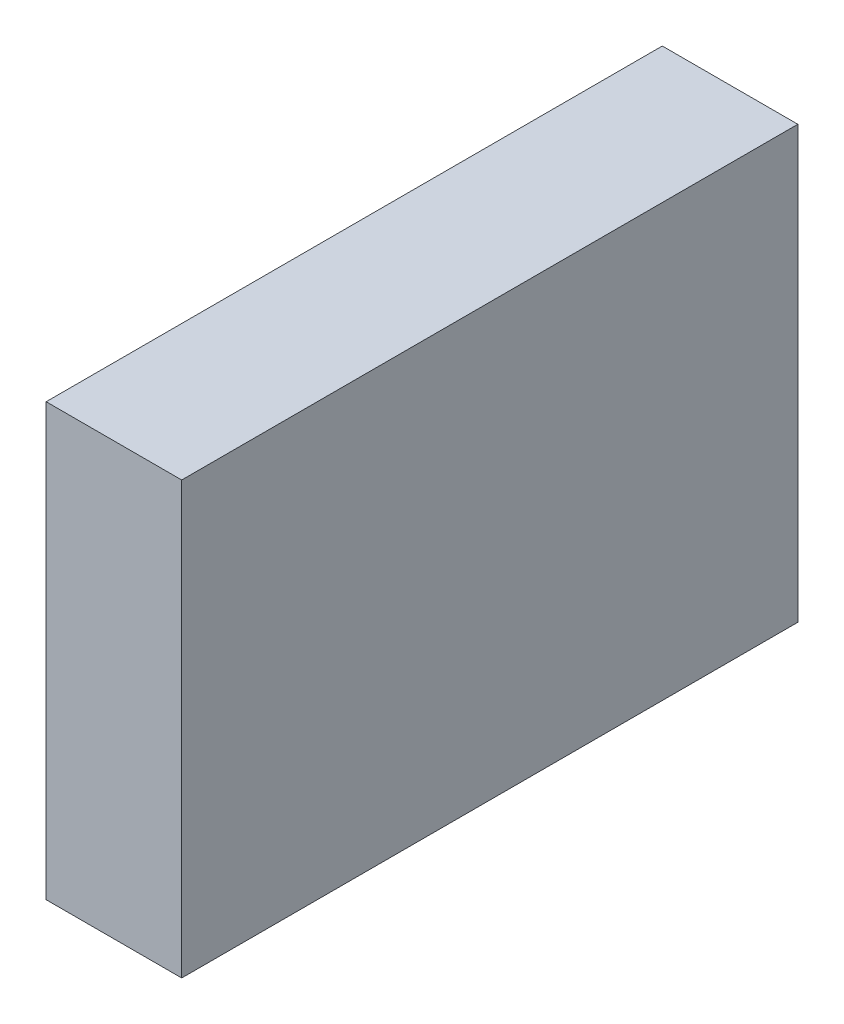
ISO-10303-21;
HEADER;
FILE_DESCRIPTION(('STEP AP214'),'2;1');
FILE_NAME('part.step','',(''),(''),'','','');
FILE_SCHEMA(('AUTOMOTIVE_DESIGN { 1 0 10303 214 1 1 1 1 }'));
ENDSEC;
DATA;
#1=APPLICATION_CONTEXT('core data for automotive mechanical design processes');
#2=APPLICATION_PROTOCOL_DEFINITION('international standard','automotive_design',2000,#1);
#3=PRODUCT_CONTEXT('',#1,'mechanical');
#4=PRODUCT('Part','Part','',(#3));
#5=PRODUCT_RELATED_PRODUCT_CATEGORY('part','',(#4));
#6=PRODUCT_DEFINITION_FORMATION('','',#4);
#7=PRODUCT_DEFINITION_CONTEXT('part definition',#1,'design');
#8=PRODUCT_DEFINITION('design','',#6,#7);
#9=PRODUCT_DEFINITION_SHAPE('','',#8);
#10=(LENGTH_UNIT() NAMED_UNIT(*) SI_UNIT(.MILLI.,.METRE.));
#11=(NAMED_UNIT(*) PLANE_ANGLE_UNIT() SI_UNIT($,.RADIAN.));
#12=(NAMED_UNIT(*) SI_UNIT($,.STERADIAN.) SOLID_ANGLE_UNIT());
#13=UNCERTAINTY_MEASURE_WITH_UNIT(LENGTH_MEASURE(1.E-05),#10,'distance_accuracy_value','');
#14=(GEOMETRIC_REPRESENTATION_CONTEXT(3) GLOBAL_UNCERTAINTY_ASSIGNED_CONTEXT((#13)) GLOBAL_UNIT_ASSIGNED_CONTEXT((#10,
#11,#12)) REPRESENTATION_CONTEXT('',''));
#15=CARTESIAN_POINT('',(0.,0.,0.));
#16=DIRECTION('',(0.,0.,1.));
#17=DIRECTION('',(1.,0.,0.));
#18=AXIS2_PLACEMENT_3D('',#15,#16,#17);
#19=CARTESIAN_POINT('',(0.,70.,0.));
#20=DIRECTION('',(0.,0.,1.));
#21=DIRECTION('',(1.,0.,0.));
#22=AXIS2_PLACEMENT_3D('',#19,#20,#21);
#23=PLANE('',#22);
#24=DIRECTION('',(0.,1.,0.));
#25=VECTOR('',#24,1.);
#26=CARTESIAN_POINT('',(0.,0.,0.));
#27=LINE('',#26,#25);
#28=CARTESIAN_POINT('',(0.,0.,0.));
#29=VERTEX_POINT('',#28);
#30=CARTESIAN_POINT('',(0.,70.,0.));
#31=VERTEX_POINT('',#30);
#32=EDGE_CURVE('E40',#29,#31,#27,.T.);
#33=ORIENTED_EDGE('',*,*,#32,.F.);
#34=DIRECTION('',(1.,0.,0.));
#35=VECTOR('',#34,1.);
#36=CARTESIAN_POINT('',(0.,0.,0.));
#37=LINE('',#36,#35);
#38=CARTESIAN_POINT('',(22.,0.,0.));
#39=VERTEX_POINT('',#38);
#40=EDGE_CURVE('E11',#29,#39,#37,.T.);
#41=ORIENTED_EDGE('',*,*,#40,.T.);
#42=DIRECTION('',(0.,-1.,0.));
#43=VECTOR('',#42,1.);
#44=CARTESIAN_POINT('',(22.,0.,0.));
#45=LINE('',#44,#43);
#46=CARTESIAN_POINT('',(22.,70.,0.));
#47=VERTEX_POINT('',#46);
#48=EDGE_CURVE('E102',#47,#39,#45,.T.);
#49=ORIENTED_EDGE('',*,*,#48,.F.);
#50=DIRECTION('',(1.,0.,0.));
#51=VECTOR('',#50,1.);
#52=CARTESIAN_POINT('',(0.,70.,0.));
#53=LINE('',#52,#51);
#54=EDGE_CURVE('E27',#31,#47,#53,.T.);
#55=ORIENTED_EDGE('',*,*,#54,.F.);
#56=EDGE_LOOP('',(#33,#41,#49,#55));
#57=FACE_BOUND('',#56,.T.);
#58=ADVANCED_FACE('F16',(#57),#23,.T.);
#59=CARTESIAN_POINT('',(0.,70.,-100.));
#60=DIRECTION('',(0.,1.,0.));
#61=DIRECTION('',(1.,0.,0.));
#62=AXIS2_PLACEMENT_3D('',#59,#60,#61);
#63=PLANE('',#62);
#64=DIRECTION('',(0.,0.,-1.));
#65=VECTOR('',#64,1.);
#66=CARTESIAN_POINT('',(0.,70.,0.));
#67=LINE('',#66,#65);
#68=CARTESIAN_POINT('',(0.,70.,-100.));
#69=VERTEX_POINT('',#68);
#70=EDGE_CURVE('E74',#31,#69,#67,.T.);
#71=ORIENTED_EDGE('',*,*,#70,.F.);
#72=ORIENTED_EDGE('',*,*,#54,.T.);
#73=DIRECTION('',(0.,0.,1.));
#74=VECTOR('',#73,1.);
#75=CARTESIAN_POINT('',(22.,70.,0.));
#76=LINE('',#75,#74);
#77=CARTESIAN_POINT('',(22.,70.,-100.));
#78=VERTEX_POINT('',#77);
#79=EDGE_CURVE('E20',#78,#47,#76,.T.);
#80=ORIENTED_EDGE('',*,*,#79,.F.);
#81=DIRECTION('',(1.,0.,0.));
#82=VECTOR('',#81,1.);
#83=CARTESIAN_POINT('',(0.,70.,-100.));
#84=LINE('',#83,#82);
#85=EDGE_CURVE('E83',#69,#78,#84,.T.);
#86=ORIENTED_EDGE('',*,*,#85,.F.);
#87=EDGE_LOOP('',(#71,#72,#80,#86));
#88=FACE_BOUND('',#87,.T.);
#89=ADVANCED_FACE('F84',(#88),#63,.T.);
#90=CARTESIAN_POINT('',(0.,0.,-100.));
#91=DIRECTION('',(0.,0.,-1.));
#92=DIRECTION('',(0.,-1.,0.));
#93=AXIS2_PLACEMENT_3D('',#90,#91,#92);
#94=PLANE('',#93);
#95=DIRECTION('',(0.,-1.,0.));
#96=VECTOR('',#95,1.);
#97=CARTESIAN_POINT('',(0.,70.,-100.));
#98=LINE('',#97,#96);
#99=CARTESIAN_POINT('',(0.,0.,-100.));
#100=VERTEX_POINT('',#99);
#101=EDGE_CURVE('E78',#69,#100,#98,.T.);
#102=ORIENTED_EDGE('',*,*,#101,.F.);
#103=ORIENTED_EDGE('',*,*,#85,.T.);
#104=DIRECTION('',(0.,1.,0.));
#105=VECTOR('',#104,1.);
#106=CARTESIAN_POINT('',(22.,70.,-100.));
#107=LINE('',#106,#105);
#108=CARTESIAN_POINT('',(22.,0.,-100.));
#109=VERTEX_POINT('',#108);
#110=EDGE_CURVE('E67',#109,#78,#107,.T.);
#111=ORIENTED_EDGE('',*,*,#110,.F.);
#112=DIRECTION('',(1.,0.,0.));
#113=VECTOR('',#112,1.);
#114=CARTESIAN_POINT('',(0.,0.,-100.));
#115=LINE('',#114,#113);
#116=EDGE_CURVE('E87',#100,#109,#115,.T.);
#117=ORIENTED_EDGE('',*,*,#116,.F.);
#118=EDGE_LOOP('',(#102,#103,#111,#117));
#119=FACE_BOUND('',#118,.T.);
#120=ADVANCED_FACE('F89',(#119),#94,.T.);
#121=CARTESIAN_POINT('',(0.,0.,0.));
#122=DIRECTION('',(0.,-1.,0.));
#123=DIRECTION('',(0.,0.,-1.));
#124=AXIS2_PLACEMENT_3D('',#121,#122,#123);
#125=PLANE('',#124);
#126=DIRECTION('',(0.,0.,1.));
#127=VECTOR('',#126,1.);
#128=CARTESIAN_POINT('',(0.,0.,-100.));
#129=LINE('',#128,#127);
#130=EDGE_CURVE('E101',#100,#29,#129,.T.);
#131=ORIENTED_EDGE('',*,*,#130,.F.);
#132=ORIENTED_EDGE('',*,*,#116,.T.);
#133=DIRECTION('',(0.,0.,-1.));
#134=VECTOR('',#133,1.);
#135=CARTESIAN_POINT('',(22.,0.,-100.));
#136=LINE('',#135,#134);
#137=EDGE_CURVE('E104',#39,#109,#136,.T.);
#138=ORIENTED_EDGE('',*,*,#137,.F.);
#139=ORIENTED_EDGE('',*,*,#40,.F.);
#140=EDGE_LOOP('',(#131,#132,#138,#139));
#141=FACE_BOUND('',#140,.T.);
#142=ADVANCED_FACE('F122',(#141),#125,.T.);
#143=CARTESIAN_POINT('',(22.,35.,-50.));
#144=DIRECTION('',(1.,0.,0.));
#145=DIRECTION('',(0.,1.,0.));
#146=AXIS2_PLACEMENT_3D('',#143,#144,#145);
#147=PLANE('',#146);
#148=ORIENTED_EDGE('',*,*,#137,.T.);
#149=ORIENTED_EDGE('',*,*,#110,.T.);
#150=ORIENTED_EDGE('',*,*,#79,.T.);
#151=ORIENTED_EDGE('',*,*,#48,.T.);
#152=EDGE_LOOP('',(#148,#149,#150,#151));
#153=FACE_BOUND('',#152,.T.);
#154=ADVANCED_FACE('F124',(#153),#147,.T.);
#155=CARTESIAN_POINT('',(0.,35.,-50.));
#156=DIRECTION('',(1.,0.,0.));
#157=DIRECTION('',(0.,1.,0.));
#158=AXIS2_PLACEMENT_3D('',#155,#156,#157);
#159=PLANE('',#158);
#160=ORIENTED_EDGE('',*,*,#130,.T.);
#161=ORIENTED_EDGE('',*,*,#32,.T.);
#162=ORIENTED_EDGE('',*,*,#70,.T.);
#163=ORIENTED_EDGE('',*,*,#101,.T.);
#164=EDGE_LOOP('',(#160,#161,#162,#163));
#165=FACE_BOUND('',#164,.T.);
#166=ADVANCED_FACE('F18',(#165),#159,.F.);
#167=CLOSED_SHELL('',(#58,#89,#120,#142,#154,#166));
#168=MANIFOLD_SOLID_BREP('B1',#167);
#169=ADVANCED_BREP_SHAPE_REPRESENTATION('',(#18,#168),#14);
#170=SHAPE_DEFINITION_REPRESENTATION(#9,#169);
ENDSEC;
END-ISO-10303-21;
